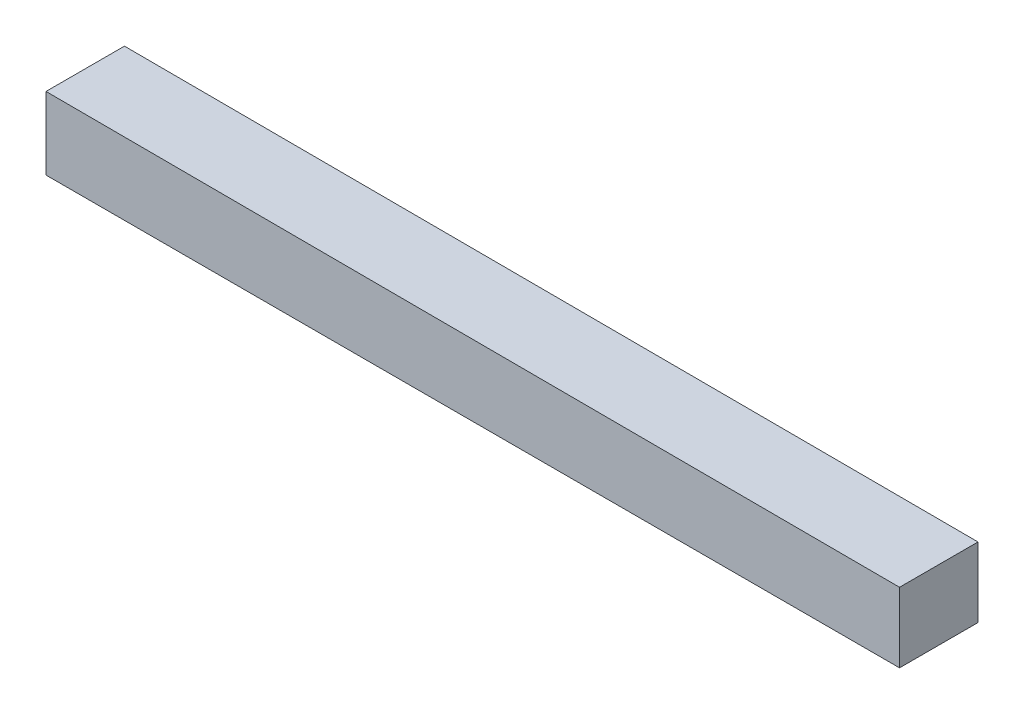
ISO-10303-21;
HEADER;
FILE_DESCRIPTION(('STEP AP214'),'2;1');
FILE_NAME('part.step','',(''),(''),'','','');
FILE_SCHEMA(('AUTOMOTIVE_DESIGN { 1 0 10303 214 1 1 1 1 }'));
ENDSEC;
DATA;
#1=APPLICATION_CONTEXT('core data for automotive mechanical design processes');
#2=APPLICATION_PROTOCOL_DEFINITION('international standard','automotive_design',2000,#1);
#3=PRODUCT_CONTEXT('',#1,'mechanical');
#4=PRODUCT('Part','Part','',(#3));
#5=PRODUCT_RELATED_PRODUCT_CATEGORY('part','',(#4));
#6=PRODUCT_DEFINITION_FORMATION('','',#4);
#7=PRODUCT_DEFINITION_CONTEXT('part definition',#1,'design');
#8=PRODUCT_DEFINITION('design','',#6,#7);
#9=PRODUCT_DEFINITION_SHAPE('','',#8);
#10=(LENGTH_UNIT() NAMED_UNIT(*) SI_UNIT(.MILLI.,.METRE.));
#11=(NAMED_UNIT(*) PLANE_ANGLE_UNIT() SI_UNIT($,.RADIAN.));
#12=(NAMED_UNIT(*) SI_UNIT($,.STERADIAN.) SOLID_ANGLE_UNIT());
#13=UNCERTAINTY_MEASURE_WITH_UNIT(LENGTH_MEASURE(1.E-05),#10,'distance_accuracy_value','');
#14=(GEOMETRIC_REPRESENTATION_CONTEXT(3) GLOBAL_UNCERTAINTY_ASSIGNED_CONTEXT((#13)) GLOBAL_UNIT_ASSIGNED_CONTEXT((#10,
#11,#12)) REPRESENTATION_CONTEXT('',''));
#15=CARTESIAN_POINT('',(0.,0.,0.));
#16=DIRECTION('',(0.,0.,1.));
#17=DIRECTION('',(1.,0.,0.));
#18=AXIS2_PLACEMENT_3D('',#15,#16,#17);
#19=CARTESIAN_POINT('',(-28.866229570655,-0.0235312078068596,5.));
#20=DIRECTION('',(1.,0.,0.));
#21=DIRECTION('',(0.,0.,-1.));
#22=AXIS2_PLACEMENT_3D('',#19,#20,#21);
#23=PLANE('',#22);
#24=DIRECTION('',(0.,-1.,0.));
#25=VECTOR('',#24,1.);
#26=CARTESIAN_POINT('',(-28.866229570655,-0.0235312078068596,0.));
#27=LINE('',#26,#25);
#28=CARTESIAN_POINT('',(-28.866229570655,-0.0235312078068596,0.));
#29=VERTEX_POINT('',#28);
#30=CARTESIAN_POINT('',(-28.866229570655,-4.64036862064887,0.));
#31=VERTEX_POINT('',#30);
#32=EDGE_CURVE('E107',#29,#31,#27,.T.);
#33=ORIENTED_EDGE('',*,*,#32,.T.);
#34=DIRECTION('',(0.,0.,-1.));
#35=VECTOR('',#34,1.);
#36=CARTESIAN_POINT('',(-28.866229570655,-4.64036862064887,5.));
#37=LINE('',#36,#35);
#38=CARTESIAN_POINT('',(-28.866229570655,-4.64036862064887,5.));
#39=VERTEX_POINT('',#38);
#40=EDGE_CURVE('E11',#39,#31,#37,.T.);
#41=ORIENTED_EDGE('',*,*,#40,.F.);
#42=DIRECTION('',(0.,-1.,0.));
#43=VECTOR('',#42,1.);
#44=CARTESIAN_POINT('',(-28.866229570655,-0.0235312078068596,5.));
#45=LINE('',#44,#43);
#46=CARTESIAN_POINT('',(-28.866229570655,-0.0235312078068596,5.));
#47=VERTEX_POINT('',#46);
#48=EDGE_CURVE('E91',#47,#39,#45,.T.);
#49=ORIENTED_EDGE('',*,*,#48,.F.);
#50=DIRECTION('',(0.,0.,-1.));
#51=VECTOR('',#50,1.);
#52=CARTESIAN_POINT('',(-28.866229570655,-0.0235312078068596,5.));
#53=LINE('',#52,#51);
#54=EDGE_CURVE('E103',#47,#29,#53,.T.);
#55=ORIENTED_EDGE('',*,*,#54,.T.);
#56=EDGE_LOOP('',(#33,#41,#49,#55));
#57=FACE_BOUND('',#56,.T.);
#58=ADVANCED_FACE('F39',(#57),#23,.F.);
#59=CARTESIAN_POINT('',(-28.866229570655,-4.64036862064887,5.));
#60=DIRECTION('',(0.,1.,0.));
#61=DIRECTION('',(0.,0.,1.));
#62=AXIS2_PLACEMENT_3D('',#59,#60,#61);
#63=PLANE('',#62);
#64=DIRECTION('',(1.,0.,0.));
#65=VECTOR('',#64,1.);
#66=CARTESIAN_POINT('',(-28.866229570655,-4.64036862064887,0.));
#67=LINE('',#66,#65);
#68=CARTESIAN_POINT('',(25.5236112622286,-4.64036862064887,0.));
#69=VERTEX_POINT('',#68);
#70=EDGE_CURVE('E96',#31,#69,#67,.T.);
#71=ORIENTED_EDGE('',*,*,#70,.T.);
#72=DIRECTION('',(0.,0.,-1.));
#73=VECTOR('',#72,1.);
#74=CARTESIAN_POINT('',(25.5236112622286,-4.64036862064887,5.));
#75=LINE('',#74,#73);
#76=CARTESIAN_POINT('',(25.5236112622286,-4.64036862064887,5.));
#77=VERTEX_POINT('',#76);
#78=EDGE_CURVE('E48',#77,#69,#75,.T.);
#79=ORIENTED_EDGE('',*,*,#78,.F.);
#80=DIRECTION('',(1.,0.,0.));
#81=VECTOR('',#80,1.);
#82=CARTESIAN_POINT('',(-28.866229570655,-4.64036862064887,5.));
#83=LINE('',#82,#81);
#84=EDGE_CURVE('E86',#39,#77,#83,.T.);
#85=ORIENTED_EDGE('',*,*,#84,.F.);
#86=ORIENTED_EDGE('',*,*,#40,.T.);
#87=EDGE_LOOP('',(#71,#79,#85,#86));
#88=FACE_BOUND('',#87,.T.);
#89=ADVANCED_FACE('F95',(#88),#63,.F.);
#90=CARTESIAN_POINT('',(25.5236112622286,-4.64036862064887,5.));
#91=DIRECTION('',(-1.,0.,0.));
#92=DIRECTION('',(0.,-1.,0.));
#93=AXIS2_PLACEMENT_3D('',#90,#91,#92);
#94=PLANE('',#93);
#95=DIRECTION('',(0.,1.,0.));
#96=VECTOR('',#95,1.);
#97=CARTESIAN_POINT('',(25.5236112622286,-4.64036862064887,0.));
#98=LINE('',#97,#96);
#99=CARTESIAN_POINT('',(25.5236112622286,-0.19126465090125,0.));
#100=VERTEX_POINT('',#99);
#101=EDGE_CURVE('E73',#69,#100,#98,.T.);
#102=ORIENTED_EDGE('',*,*,#101,.T.);
#103=DIRECTION('',(0.,0.,-1.));
#104=VECTOR('',#103,1.);
#105=CARTESIAN_POINT('',(25.5236112622286,-0.19126465090125,5.));
#106=LINE('',#105,#104);
#107=CARTESIAN_POINT('',(25.5236112622286,-0.19126465090125,5.));
#108=VERTEX_POINT('',#107);
#109=EDGE_CURVE('E98',#108,#100,#106,.T.);
#110=ORIENTED_EDGE('',*,*,#109,.F.);
#111=DIRECTION('',(0.,1.,0.));
#112=VECTOR('',#111,1.);
#113=CARTESIAN_POINT('',(25.5236112622286,-4.64036862064887,5.));
#114=LINE('',#113,#112);
#115=EDGE_CURVE('E89',#77,#108,#114,.T.);
#116=ORIENTED_EDGE('',*,*,#115,.F.);
#117=ORIENTED_EDGE('',*,*,#78,.T.);
#118=EDGE_LOOP('',(#102,#110,#116,#117));
#119=FACE_BOUND('',#118,.T.);
#120=ADVANCED_FACE('F99',(#119),#94,.F.);
#121=CARTESIAN_POINT('',(25.5236112622286,-0.19126465090125,5.));
#122=DIRECTION('',(-0.00308389660488735,-0.999995244779559,0.));
#123=DIRECTION('',(0.999995244779559,-0.00308389660488735,0.));
#124=AXIS2_PLACEMENT_3D('',#121,#122,#123);
#125=PLANE('',#124);
#126=DIRECTION('',(-0.999995244779559,0.00308389660488735,0.));
#127=VECTOR('',#126,1.);
#128=CARTESIAN_POINT('',(25.5236112622286,-0.19126465090125,0.));
#129=LINE('',#128,#127);
#130=EDGE_CURVE('E79',#100,#29,#129,.T.);
#131=ORIENTED_EDGE('',*,*,#130,.T.);
#132=ORIENTED_EDGE('',*,*,#54,.F.);
#133=DIRECTION('',(-0.999995244779559,0.00308389660488735,0.));
#134=VECTOR('',#133,1.);
#135=CARTESIAN_POINT('',(25.5236112622286,-0.19126465090125,5.));
#136=LINE('',#135,#134);
#137=EDGE_CURVE('E56',#108,#47,#136,.T.);
#138=ORIENTED_EDGE('',*,*,#137,.F.);
#139=ORIENTED_EDGE('',*,*,#109,.T.);
#140=EDGE_LOOP('',(#131,#132,#138,#139));
#141=FACE_BOUND('',#140,.T.);
#142=ADVANCED_FACE('F120',(#141),#125,.F.);
#143=CARTESIAN_POINT('',(0.,0.,5.));
#144=DIRECTION('',(0.,0.,1.));
#145=DIRECTION('',(1.,0.,0.));
#146=AXIS2_PLACEMENT_3D('',#143,#144,#145);
#147=PLANE('',#146);
#148=ORIENTED_EDGE('',*,*,#48,.T.);
#149=ORIENTED_EDGE('',*,*,#84,.T.);
#150=ORIENTED_EDGE('',*,*,#115,.T.);
#151=ORIENTED_EDGE('',*,*,#137,.T.);
#152=EDGE_LOOP('',(#148,#149,#150,#151));
#153=FACE_BOUND('',#152,.T.);
#154=ADVANCED_FACE('F87',(#153),#147,.T.);
#155=CARTESIAN_POINT('',(0.,0.,0.));
#156=DIRECTION('',(0.,0.,1.));
#157=DIRECTION('',(1.,0.,0.));
#158=AXIS2_PLACEMENT_3D('',#155,#156,#157);
#159=PLANE('',#158);
#160=ORIENTED_EDGE('',*,*,#32,.F.);
#161=ORIENTED_EDGE('',*,*,#130,.F.);
#162=ORIENTED_EDGE('',*,*,#101,.F.);
#163=ORIENTED_EDGE('',*,*,#70,.F.);
#164=EDGE_LOOP('',(#160,#161,#162,#163));
#165=FACE_BOUND('',#164,.T.);
#166=ADVANCED_FACE('F123',(#165),#159,.F.);
#167=CLOSED_SHELL('',(#58,#89,#120,#142,#154,#166));
#168=MANIFOLD_SOLID_BREP('B2',#167);
#169=ADVANCED_BREP_SHAPE_REPRESENTATION('',(#18,#168),#14);
#170=SHAPE_DEFINITION_REPRESENTATION(#9,#169);
ENDSEC;
END-ISO-10303-21;
